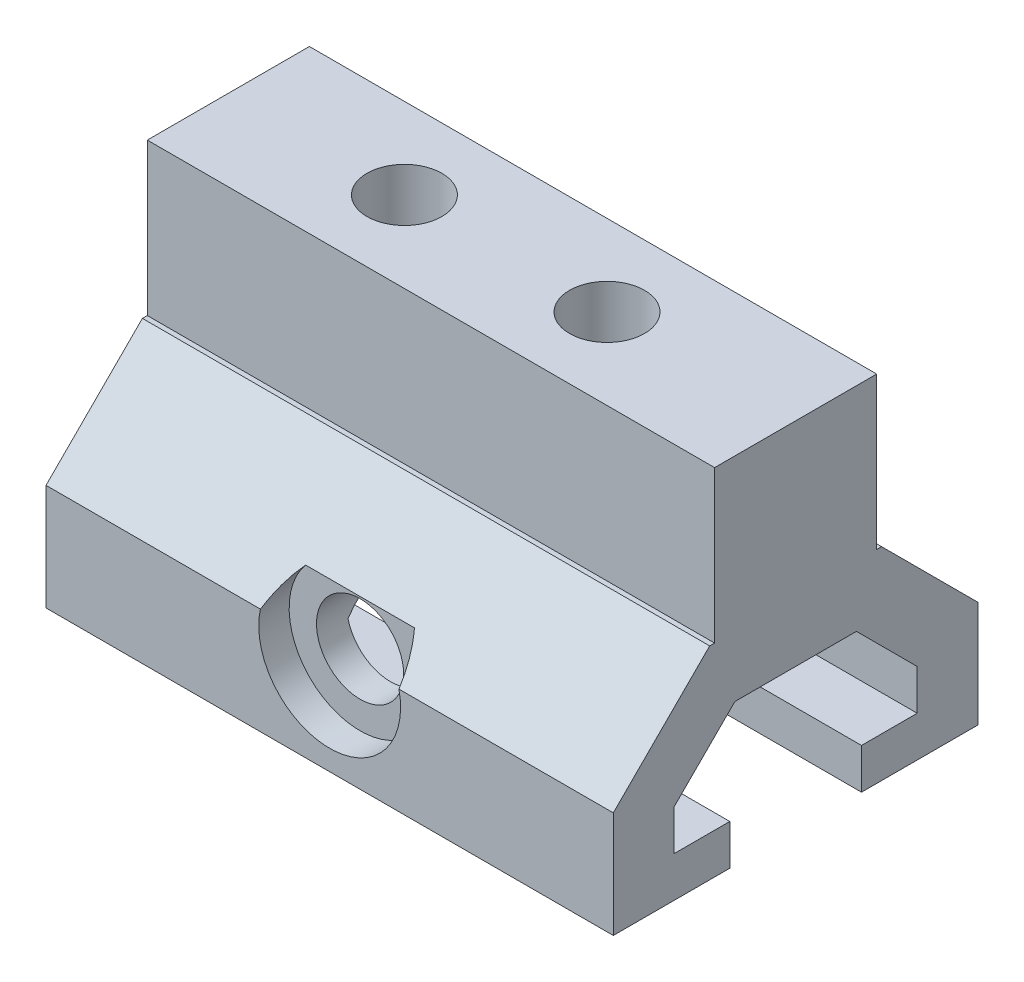
ISO-10303-21;
HEADER;
FILE_DESCRIPTION(('STEP AP214'),'2;1');
FILE_NAME('part.step','',(''),(''),'','','');
FILE_SCHEMA(('AUTOMOTIVE_DESIGN { 1 0 10303 214 1 1 1 1 }'));
ENDSEC;
DATA;
#1=APPLICATION_CONTEXT('core data for automotive mechanical design processes');
#2=APPLICATION_PROTOCOL_DEFINITION('international standard','automotive_design',2000,#1);
#3=PRODUCT_CONTEXT('',#1,'mechanical');
#4=PRODUCT('Part','Part','',(#3));
#5=PRODUCT_RELATED_PRODUCT_CATEGORY('part','',(#4));
#6=PRODUCT_DEFINITION_FORMATION('','',#4);
#7=PRODUCT_DEFINITION_CONTEXT('part definition',#1,'design');
#8=PRODUCT_DEFINITION('design','',#6,#7);
#9=PRODUCT_DEFINITION_SHAPE('','',#8);
#10=(LENGTH_UNIT() NAMED_UNIT(*) SI_UNIT(.MILLI.,.METRE.));
#11=(NAMED_UNIT(*) PLANE_ANGLE_UNIT() SI_UNIT($,.RADIAN.));
#12=(NAMED_UNIT(*) SI_UNIT($,.STERADIAN.) SOLID_ANGLE_UNIT());
#13=UNCERTAINTY_MEASURE_WITH_UNIT(LENGTH_MEASURE(1.E-05),#10,'distance_accuracy_value','');
#14=(GEOMETRIC_REPRESENTATION_CONTEXT(3) GLOBAL_UNCERTAINTY_ASSIGNED_CONTEXT((#13)) GLOBAL_UNIT_ASSIGNED_CONTEXT((#10,
#11,#12)) REPRESENTATION_CONTEXT('',''));
#15=CARTESIAN_POINT('',(0.,0.,0.));
#16=DIRECTION('',(0.,0.,1.));
#17=DIRECTION('',(1.,0.,0.));
#18=AXIS2_PLACEMENT_3D('',#15,#16,#17);
#19=CARTESIAN_POINT('',(-5.31,7.5,0.));
#20=DIRECTION('',(0.,-1.,0.));
#21=DIRECTION('',(0.,0.,-1.));
#22=AXIS2_PLACEMENT_3D('',#19,#20,#21);
#23=CYLINDRICAL_SURFACE('',#22,1.85);
#24=CARTESIAN_POINT('',(-5.31,7.5,0.));
#25=DIRECTION('',(0.,1.,0.));
#26=DIRECTION('',(0.,0.,1.));
#27=AXIS2_PLACEMENT_3D('',#24,#25,#26);
#28=CIRCLE('',#27,1.85);
#29=CARTESIAN_POINT('',(-5.31,7.5,1.85));
#30=VERTEX_POINT('',#29);
#31=EDGE_CURVE('E285',#30,#30,#28,.T.);
#32=ORIENTED_EDGE('',*,*,#31,.T.);
#33=EDGE_LOOP('',(#32));
#34=FACE_BOUND('',#33,.T.);
#35=CARTESIAN_POINT('',(-5.31,0.5,0.));
#36=DIRECTION('',(0.,-1.,0.));
#37=DIRECTION('',(0.,0.,-1.));
#38=AXIS2_PLACEMENT_3D('',#35,#36,#37);
#39=CIRCLE('',#38,1.85);
#40=CARTESIAN_POINT('',(-5.31,0.499999999999999,-1.85));
#41=VERTEX_POINT('',#40);
#42=EDGE_CURVE('E39',#41,#41,#39,.T.);
#43=ORIENTED_EDGE('',*,*,#42,.T.);
#44=EDGE_LOOP('',(#43));
#45=FACE_BOUND('',#44,.T.);
#46=ADVANCED_FACE('F35',(#34,#45),#23,.F.);
#47=CARTESIAN_POINT('',(4.69,7.5,0.));
#48=DIRECTION('',(0.,-1.,0.));
#49=DIRECTION('',(0.,0.,-1.));
#50=AXIS2_PLACEMENT_3D('',#47,#48,#49);
#51=CYLINDRICAL_SURFACE('',#50,1.85);
#52=CARTESIAN_POINT('',(4.69,7.5,0.));
#53=DIRECTION('',(0.,1.,0.));
#54=DIRECTION('',(0.,0.,1.));
#55=AXIS2_PLACEMENT_3D('',#52,#53,#54);
#56=CIRCLE('',#55,1.85);
#57=CARTESIAN_POINT('',(4.69,7.5,1.85));
#58=VERTEX_POINT('',#57);
#59=EDGE_CURVE('E237',#58,#58,#56,.T.);
#60=ORIENTED_EDGE('',*,*,#59,.T.);
#61=EDGE_LOOP('',(#60));
#62=FACE_BOUND('',#61,.T.);
#63=CARTESIAN_POINT('',(4.69,0.5,0.));
#64=DIRECTION('',(0.,-1.,0.));
#65=DIRECTION('',(0.,0.,-1.));
#66=AXIS2_PLACEMENT_3D('',#63,#64,#65);
#67=CIRCLE('',#66,1.85);
#68=CARTESIAN_POINT('',(4.69,0.499999999999999,-1.85));
#69=VERTEX_POINT('',#68);
#70=EDGE_CURVE('E310',#69,#69,#67,.T.);
#71=ORIENTED_EDGE('',*,*,#70,.T.);
#72=EDGE_LOOP('',(#71));
#73=FACE_BOUND('',#72,.T.);
#74=ADVANCED_FACE('F561',(#62,#73),#51,.F.);
#75=CARTESIAN_POINT('',(14.,-3.,2.99999999999996));
#76=DIRECTION('',(0.,-1.,0.));
#77=DIRECTION('',(0.,0.,-1.));
#78=AXIS2_PLACEMENT_3D('',#75,#76,#77);
#79=PLANE('',#78);
#80=CARTESIAN_POINT('',(-5.31,-3.,0.));
#81=DIRECTION('',(0.,-1.,0.));
#82=DIRECTION('',(0.,0.,-1.));
#83=AXIS2_PLACEMENT_3D('',#80,#81,#82);
#84=CIRCLE('',#83,3.);
#85=CARTESIAN_POINT('',(-5.31,-3.,-2.99999999999996));
#86=VERTEX_POINT('',#85);
#87=CARTESIAN_POINT('',(-5.31,-3.,2.99999999999997));
#88=VERTEX_POINT('',#87);
#89=EDGE_CURVE('E318',#86,#88,#84,.T.);
#90=ORIENTED_EDGE('',*,*,#89,.F.);
#91=DIRECTION('',(-1.,0.,0.));
#92=VECTOR('',#91,1.);
#93=CARTESIAN_POINT('',(14.,-3.,-2.99999999999997));
#94=LINE('',#93,#92);
#95=CARTESIAN_POINT('',(4.69,-3.,-2.99999999999997));
#96=VERTEX_POINT('',#95);
#97=EDGE_CURVE('E249',#96,#86,#94,.T.);
#98=ORIENTED_EDGE('',*,*,#97,.F.);
#99=CARTESIAN_POINT('',(4.69,-3.,0.));
#100=DIRECTION('',(0.,-1.,0.));
#101=DIRECTION('',(0.,0.,-1.));
#102=AXIS2_PLACEMENT_3D('',#99,#100,#101);
#103=CIRCLE('',#102,3.);
#104=CARTESIAN_POINT('',(4.69,-3.,2.99999999999997));
#105=VERTEX_POINT('',#104);
#106=EDGE_CURVE('E333',#105,#96,#103,.T.);
#107=ORIENTED_EDGE('',*,*,#106,.F.);
#108=DIRECTION('',(-1.,0.,0.));
#109=VECTOR('',#108,1.);
#110=CARTESIAN_POINT('',(14.,-3.,2.99999999999996));
#111=LINE('',#110,#109);
#112=EDGE_CURVE('E244',#105,#88,#111,.T.);
#113=ORIENTED_EDGE('',*,*,#112,.T.);
#114=EDGE_LOOP('',(#90,#98,#107,#113));
#115=FACE_BOUND('',#114,.T.);
#116=ADVANCED_FACE('F515',(#115),#79,.T.);
#117=EDGE_CURVE('E331',#96,#105,#103,.T.);
#118=ORIENTED_EDGE('',*,*,#117,.F.);
#119=CARTESIAN_POINT('',(14.,-3.,-2.99999999999997));
#120=VERTEX_POINT('',#119);
#121=EDGE_CURVE('E246',#120,#96,#94,.T.);
#122=ORIENTED_EDGE('',*,*,#121,.F.);
#123=DIRECTION('',(0.,0.,1.));
#124=VECTOR('',#123,1.);
#125=CARTESIAN_POINT('',(14.,-3.,2.99999999999996));
#126=LINE('',#125,#124);
#127=CARTESIAN_POINT('',(14.,-3.,2.99999999999996));
#128=VERTEX_POINT('',#127);
#129=EDGE_CURVE('E374',#120,#128,#126,.T.);
#130=ORIENTED_EDGE('',*,*,#129,.T.);
#131=EDGE_CURVE('E239',#128,#105,#111,.T.);
#132=ORIENTED_EDGE('',*,*,#131,.T.);
#133=EDGE_LOOP('',(#118,#122,#130,#132));
#134=FACE_BOUND('',#133,.T.);
#135=ADVANCED_FACE('F519',(#134),#79,.T.);
#136=CARTESIAN_POINT('',(0.,7.5,0.));
#137=DIRECTION('',(0.,1.,0.));
#138=DIRECTION('',(0.,0.,1.));
#139=AXIS2_PLACEMENT_3D('',#136,#137,#138);
#140=PLANE('',#139);
#141=ORIENTED_EDGE('',*,*,#31,.F.);
#142=EDGE_LOOP('',(#141));
#143=FACE_BOUND('',#142,.T.);
#144=DIRECTION('',(0.,0.,-1.));
#145=VECTOR('',#144,1.);
#146=CARTESIAN_POINT('',(14.,7.5,-4.));
#147=LINE('',#146,#145);
#148=CARTESIAN_POINT('',(14.,7.5,4.));
#149=VERTEX_POINT('',#148);
#150=CARTESIAN_POINT('',(14.,7.5,-4.));
#151=VERTEX_POINT('',#150);
#152=EDGE_CURVE('E289',#149,#151,#147,.T.);
#153=ORIENTED_EDGE('',*,*,#152,.T.);
#154=DIRECTION('',(-1.,0.,0.));
#155=VECTOR('',#154,1.);
#156=CARTESIAN_POINT('',(-14.,7.5,-4.));
#157=LINE('',#156,#155);
#158=CARTESIAN_POINT('',(-14.,7.5,-4.));
#159=VERTEX_POINT('',#158);
#160=EDGE_CURVE('E292',#151,#159,#157,.T.);
#161=ORIENTED_EDGE('',*,*,#160,.T.);
#162=DIRECTION('',(0.,0.,1.));
#163=VECTOR('',#162,1.);
#164=CARTESIAN_POINT('',(-14.,7.5,-4.));
#165=LINE('',#164,#163);
#166=CARTESIAN_POINT('',(-14.,7.5,4.));
#167=VERTEX_POINT('',#166);
#168=EDGE_CURVE('E295',#159,#167,#165,.T.);
#169=ORIENTED_EDGE('',*,*,#168,.T.);
#170=DIRECTION('',(1.,0.,0.));
#171=VECTOR('',#170,1.);
#172=CARTESIAN_POINT('',(-14.,7.5,4.));
#173=LINE('',#172,#171);
#174=EDGE_CURVE('E297',#167,#149,#173,.T.);
#175=ORIENTED_EDGE('',*,*,#174,.T.);
#176=EDGE_LOOP('',(#153,#161,#169,#175));
#177=FACE_BOUND('',#176,.T.);
#178=ORIENTED_EDGE('',*,*,#59,.F.);
#179=EDGE_LOOP('',(#178));
#180=FACE_BOUND('',#179,.T.);
#181=ADVANCED_FACE('F458',(#143,#177,#180),#140,.T.);
#182=CARTESIAN_POINT('',(14.,7.5,-4.));
#183=DIRECTION('',(-1.,0.,0.));
#184=DIRECTION('',(0.,0.,1.));
#185=AXIS2_PLACEMENT_3D('',#182,#183,#184);
#186=PLANE('',#185);
#187=DIRECTION('',(0.,-1.,0.));
#188=VECTOR('',#187,1.);
#189=CARTESIAN_POINT('',(14.,7.5,4.));
#190=LINE('',#189,#188);
#191=CARTESIAN_POINT('',(14.,0.,4.));
#192=VERTEX_POINT('',#191);
#193=EDGE_CURVE('E299',#149,#192,#190,.T.);
#194=ORIENTED_EDGE('',*,*,#193,.T.);
#195=DIRECTION('',(0.,0.,-1.));
#196=VECTOR('',#195,1.);
#197=CARTESIAN_POINT('',(14.,0.,-4.24264068711924));
#198=LINE('',#197,#196);
#199=CARTESIAN_POINT('',(14.,0.,4.24264068711924));
#200=VERTEX_POINT('',#199);
#201=EDGE_CURVE('E351',#200,#192,#198,.T.);
#202=ORIENTED_EDGE('',*,*,#201,.F.);
#203=DIRECTION('',(0.,0.707106781186543,-0.707106781186552));
#204=VECTOR('',#203,1.);
#205=CARTESIAN_POINT('',(14.,0.,4.24264068711924));
#206=LINE('',#205,#204);
#207=CARTESIAN_POINT('',(14.,-4.75735931288071,9.));
#208=VERTEX_POINT('',#207);
#209=EDGE_CURVE('E347',#208,#200,#206,.T.);
#210=ORIENTED_EDGE('',*,*,#209,.F.);
#211=DIRECTION('',(0.,1.,0.));
#212=VECTOR('',#211,1.);
#213=CARTESIAN_POINT('',(14.,-4.75735931288071,9.));
#214=LINE('',#213,#212);
#215=CARTESIAN_POINT('',(14.,-10.,9.));
#216=VERTEX_POINT('',#215);
#217=EDGE_CURVE('E344',#216,#208,#214,.T.);
#218=ORIENTED_EDGE('',*,*,#217,.F.);
#219=DIRECTION('',(0.,0.,1.));
#220=VECTOR('',#219,1.);
#221=CARTESIAN_POINT('',(14.,-10.,9.));
#222=LINE('',#221,#220);
#223=CARTESIAN_POINT('',(14.,-10.,3.25));
#224=VERTEX_POINT('',#223);
#225=EDGE_CURVE('E341',#224,#216,#222,.T.);
#226=ORIENTED_EDGE('',*,*,#225,.F.);
#227=DIRECTION('',(0.,-1.,0.));
#228=VECTOR('',#227,1.);
#229=CARTESIAN_POINT('',(14.,-10.,3.25));
#230=LINE('',#229,#228);
#231=CARTESIAN_POINT('',(14.,-8.,3.25));
#232=VERTEX_POINT('',#231);
#233=EDGE_CURVE('E337',#232,#224,#230,.T.);
#234=ORIENTED_EDGE('',*,*,#233,.F.);
#235=DIRECTION('',(0.,0.,-1.));
#236=VECTOR('',#235,1.);
#237=CARTESIAN_POINT('',(14.,-8.,3.25));
#238=LINE('',#237,#236);
#239=CARTESIAN_POINT('',(14.,-8.,6.));
#240=VERTEX_POINT('',#239);
#241=EDGE_CURVE('E334',#240,#232,#238,.T.);
#242=ORIENTED_EDGE('',*,*,#241,.F.);
#243=DIRECTION('',(0.,-1.,0.));
#244=VECTOR('',#243,1.);
#245=CARTESIAN_POINT('',(14.,-8.,6.));
#246=LINE('',#245,#244);
#247=CARTESIAN_POINT('',(14.,-6.,6.));
#248=VERTEX_POINT('',#247);
#249=EDGE_CURVE('E282',#248,#240,#246,.T.);
#250=ORIENTED_EDGE('',*,*,#249,.F.);
#251=DIRECTION('',(0.,-0.707106781186543,0.707106781186552));
#252=VECTOR('',#251,1.);
#253=CARTESIAN_POINT('',(14.,-6.,6.));
#254=LINE('',#253,#252);
#255=EDGE_CURVE('E233',#128,#248,#254,.T.);
#256=ORIENTED_EDGE('',*,*,#255,.F.);
#257=ORIENTED_EDGE('',*,*,#129,.F.);
#258=DIRECTION('',(0.,0.707106781186543,0.707106781186551));
#259=VECTOR('',#258,1.);
#260=CARTESIAN_POINT('',(14.,-6.,-6.));
#261=LINE('',#260,#259);
#262=CARTESIAN_POINT('',(14.,-6.,-6.));
#263=VERTEX_POINT('',#262);
#264=EDGE_CURVE('E371',#263,#120,#261,.T.);
#265=ORIENTED_EDGE('',*,*,#264,.F.);
#266=DIRECTION('',(0.,1.,0.));
#267=VECTOR('',#266,1.);
#268=CARTESIAN_POINT('',(14.,-8.,-6.));
#269=LINE('',#268,#267);
#270=CARTESIAN_POINT('',(14.,-8.,-6.));
#271=VERTEX_POINT('',#270);
#272=EDGE_CURVE('E368',#271,#263,#269,.T.);
#273=ORIENTED_EDGE('',*,*,#272,.F.);
#274=DIRECTION('',(0.,0.,-1.));
#275=VECTOR('',#274,1.);
#276=CARTESIAN_POINT('',(14.,-8.,-3.25));
#277=LINE('',#276,#275);
#278=CARTESIAN_POINT('',(14.,-8.,-3.25));
#279=VERTEX_POINT('',#278);
#280=EDGE_CURVE('E365',#279,#271,#277,.T.);
#281=ORIENTED_EDGE('',*,*,#280,.F.);
#282=DIRECTION('',(0.,1.,0.));
#283=VECTOR('',#282,1.);
#284=CARTESIAN_POINT('',(14.,-10.,-3.25));
#285=LINE('',#284,#283);
#286=CARTESIAN_POINT('',(14.,-10.,-3.25));
#287=VERTEX_POINT('',#286);
#288=EDGE_CURVE('E362',#287,#279,#285,.T.);
#289=ORIENTED_EDGE('',*,*,#288,.F.);
#290=DIRECTION('',(0.,0.,1.));
#291=VECTOR('',#290,1.);
#292=CARTESIAN_POINT('',(14.,-10.,-9.));
#293=LINE('',#292,#291);
#294=CARTESIAN_POINT('',(14.,-10.,-9.));
#295=VERTEX_POINT('',#294);
#296=EDGE_CURVE('E359',#295,#287,#293,.T.);
#297=ORIENTED_EDGE('',*,*,#296,.F.);
#298=DIRECTION('',(0.,-1.,0.));
#299=VECTOR('',#298,1.);
#300=CARTESIAN_POINT('',(14.,-4.75735931288071,-9.00000000000001));
#301=LINE('',#300,#299);
#302=CARTESIAN_POINT('',(14.,-4.75735931288071,-9.00000000000001));
#303=VERTEX_POINT('',#302);
#304=EDGE_CURVE('E356',#303,#295,#301,.T.);
#305=ORIENTED_EDGE('',*,*,#304,.F.);
#306=DIRECTION('',(0.,-0.707106781186544,-0.707106781186551));
#307=VECTOR('',#306,1.);
#308=CARTESIAN_POINT('',(14.,0.,-4.24264068711924));
#309=LINE('',#308,#307);
#310=CARTESIAN_POINT('',(14.,0.,-4.24264068711924));
#311=VERTEX_POINT('',#310);
#312=EDGE_CURVE('E353',#311,#303,#309,.T.);
#313=ORIENTED_EDGE('',*,*,#312,.F.);
#314=CARTESIAN_POINT('',(14.,0.,-4.));
#315=VERTEX_POINT('',#314);
#316=EDGE_CURVE('E350',#315,#311,#198,.T.);
#317=ORIENTED_EDGE('',*,*,#316,.F.);
#318=DIRECTION('',(0.,-1.,0.));
#319=VECTOR('',#318,1.);
#320=CARTESIAN_POINT('',(14.,7.5,-4.));
#321=LINE('',#320,#319);
#322=EDGE_CURVE('E11',#151,#315,#321,.T.);
#323=ORIENTED_EDGE('',*,*,#322,.F.);
#324=ORIENTED_EDGE('',*,*,#152,.F.);
#325=EDGE_LOOP('',(#194,#202,#210,#218,#226,#234,#242,#250,#256,#257,#265,#273,#281,#289,#297,
#305,#313,#317,#323,#324));
#326=FACE_BOUND('',#325,.T.);
#327=ADVANCED_FACE('F37',(#326),#186,.F.);
#328=CARTESIAN_POINT('',(-14.,7.5,-4.));
#329=DIRECTION('',(0.,0.,1.));
#330=DIRECTION('',(1.,0.,0.));
#331=AXIS2_PLACEMENT_3D('',#328,#329,#330);
#332=PLANE('',#331);
#333=DIRECTION('',(-1.,0.,0.));
#334=VECTOR('',#333,1.);
#335=CARTESIAN_POINT('',(-14.,0.,-4.));
#336=LINE('',#335,#334);
#337=CARTESIAN_POINT('',(-14.,0.,-4.));
#338=VERTEX_POINT('',#337);
#339=EDGE_CURVE('E288',#315,#338,#336,.T.);
#340=ORIENTED_EDGE('',*,*,#339,.T.);
#341=DIRECTION('',(0.,-1.,0.));
#342=VECTOR('',#341,1.);
#343=CARTESIAN_POINT('',(-14.,7.5,-4.));
#344=LINE('',#343,#342);
#345=EDGE_CURVE('E44',#159,#338,#344,.T.);
#346=ORIENTED_EDGE('',*,*,#345,.F.);
#347=ORIENTED_EDGE('',*,*,#160,.F.);
#348=ORIENTED_EDGE('',*,*,#322,.T.);
#349=EDGE_LOOP('',(#340,#346,#347,#348));
#350=FACE_BOUND('',#349,.T.);
#351=ADVANCED_FACE('F463',(#350),#332,.F.);
#352=CARTESIAN_POINT('',(-14.,7.5,-4.));
#353=DIRECTION('',(1.,0.,0.));
#354=DIRECTION('',(0.,0.,-1.));
#355=AXIS2_PLACEMENT_3D('',#352,#353,#354);
#356=PLANE('',#355);
#357=ORIENTED_EDGE('',*,*,#345,.T.);
#358=DIRECTION('',(0.,0.,-1.));
#359=VECTOR('',#358,1.);
#360=CARTESIAN_POINT('',(-14.,0.,-4.24264068711924));
#361=LINE('',#360,#359);
#362=CARTESIAN_POINT('',(-14.,0.,-4.24264068711924));
#363=VERTEX_POINT('',#362);
#364=EDGE_CURVE('E393',#338,#363,#361,.T.);
#365=ORIENTED_EDGE('',*,*,#364,.T.);
#366=DIRECTION('',(0.,-0.707106781186544,-0.707106781186551));
#367=VECTOR('',#366,1.);
#368=CARTESIAN_POINT('',(-14.,0.,-4.24264068711924));
#369=LINE('',#368,#367);
#370=CARTESIAN_POINT('',(-14.,-4.75735931288071,-9.));
#371=VERTEX_POINT('',#370);
#372=EDGE_CURVE('E397',#363,#371,#369,.T.);
#373=ORIENTED_EDGE('',*,*,#372,.T.);
#374=DIRECTION('',(0.,-1.,0.));
#375=VECTOR('',#374,1.);
#376=CARTESIAN_POINT('',(-14.,-4.75735931288071,-9.));
#377=LINE('',#376,#375);
#378=CARTESIAN_POINT('',(-14.,-10.,-8.99999999999999));
#379=VERTEX_POINT('',#378);
#380=EDGE_CURVE('E400',#371,#379,#377,.T.);
#381=ORIENTED_EDGE('',*,*,#380,.T.);
#382=DIRECTION('',(0.,0.,1.));
#383=VECTOR('',#382,1.);
#384=CARTESIAN_POINT('',(-14.,-10.,-8.99999999999999));
#385=LINE('',#384,#383);
#386=CARTESIAN_POINT('',(-14.,-10.,-3.24999999999999));
#387=VERTEX_POINT('',#386);
#388=EDGE_CURVE('E403',#379,#387,#385,.T.);
#389=ORIENTED_EDGE('',*,*,#388,.T.);
#390=DIRECTION('',(0.,1.,0.));
#391=VECTOR('',#390,1.);
#392=CARTESIAN_POINT('',(-14.,-10.,-3.24999999999999));
#393=LINE('',#392,#391);
#394=CARTESIAN_POINT('',(-14.,-8.,-3.25));
#395=VERTEX_POINT('',#394);
#396=EDGE_CURVE('E406',#387,#395,#393,.T.);
#397=ORIENTED_EDGE('',*,*,#396,.T.);
#398=DIRECTION('',(0.,0.,-1.));
#399=VECTOR('',#398,1.);
#400=CARTESIAN_POINT('',(-14.,-8.,-3.25));
#401=LINE('',#400,#399);
#402=CARTESIAN_POINT('',(-14.,-8.,-6.));
#403=VERTEX_POINT('',#402);
#404=EDGE_CURVE('E409',#395,#403,#401,.T.);
#405=ORIENTED_EDGE('',*,*,#404,.T.);
#406=DIRECTION('',(0.,1.,0.));
#407=VECTOR('',#406,1.);
#408=CARTESIAN_POINT('',(-14.,-8.,-6.));
#409=LINE('',#408,#407);
#410=CARTESIAN_POINT('',(-14.,-6.,-6.));
#411=VERTEX_POINT('',#410);
#412=EDGE_CURVE('E412',#403,#411,#409,.T.);
#413=ORIENTED_EDGE('',*,*,#412,.T.);
#414=DIRECTION('',(0.,0.707106781186543,0.707106781186551));
#415=VECTOR('',#414,1.);
#416=CARTESIAN_POINT('',(-14.,-6.,-6.));
#417=LINE('',#416,#415);
#418=CARTESIAN_POINT('',(-14.,-3.,-2.99999999999996));
#419=VERTEX_POINT('',#418);
#420=EDGE_CURVE('E415',#411,#419,#417,.T.);
#421=ORIENTED_EDGE('',*,*,#420,.T.);
#422=DIRECTION('',(0.,0.,1.));
#423=VECTOR('',#422,1.);
#424=CARTESIAN_POINT('',(-14.,-3.,2.99999999999997));
#425=LINE('',#424,#423);
#426=CARTESIAN_POINT('',(-14.,-3.,2.99999999999997));
#427=VERTEX_POINT('',#426);
#428=EDGE_CURVE('E418',#419,#427,#425,.T.);
#429=ORIENTED_EDGE('',*,*,#428,.T.);
#430=DIRECTION('',(0.,-0.707106781186543,0.707106781186552));
#431=VECTOR('',#430,1.);
#432=CARTESIAN_POINT('',(-14.,-6.,6.00000000000001));
#433=LINE('',#432,#431);
#434=CARTESIAN_POINT('',(-14.,-6.,6.00000000000001));
#435=VERTEX_POINT('',#434);
#436=EDGE_CURVE('E421',#427,#435,#433,.T.);
#437=ORIENTED_EDGE('',*,*,#436,.T.);
#438=DIRECTION('',(0.,-1.,0.));
#439=VECTOR('',#438,1.);
#440=CARTESIAN_POINT('',(-14.,-8.,6.00000000000001));
#441=LINE('',#440,#439);
#442=CARTESIAN_POINT('',(-14.,-8.,6.00000000000001));
#443=VERTEX_POINT('',#442);
#444=EDGE_CURVE('E338',#435,#443,#441,.T.);
#445=ORIENTED_EDGE('',*,*,#444,.T.);
#446=DIRECTION('',(0.,0.,-1.));
#447=VECTOR('',#446,1.);
#448=CARTESIAN_POINT('',(-14.,-8.,3.25));
#449=LINE('',#448,#447);
#450=CARTESIAN_POINT('',(-14.,-8.,3.25));
#451=VERTEX_POINT('',#450);
#452=EDGE_CURVE('E316',#443,#451,#449,.T.);
#453=ORIENTED_EDGE('',*,*,#452,.T.);
#454=DIRECTION('',(0.,-1.,0.));
#455=VECTOR('',#454,1.);
#456=CARTESIAN_POINT('',(-14.,-10.,3.25));
#457=LINE('',#456,#455);
#458=CARTESIAN_POINT('',(-14.,-10.,3.25));
#459=VERTEX_POINT('',#458);
#460=EDGE_CURVE('E381',#451,#459,#457,.T.);
#461=ORIENTED_EDGE('',*,*,#460,.T.);
#462=DIRECTION('',(0.,0.,1.));
#463=VECTOR('',#462,1.);
#464=CARTESIAN_POINT('',(-14.,-10.,9.00000000000001));
#465=LINE('',#464,#463);
#466=CARTESIAN_POINT('',(-14.,-10.,9.00000000000001));
#467=VERTEX_POINT('',#466);
#468=EDGE_CURVE('E384',#459,#467,#465,.T.);
#469=ORIENTED_EDGE('',*,*,#468,.T.);
#470=DIRECTION('',(0.,1.,0.));
#471=VECTOR('',#470,1.);
#472=CARTESIAN_POINT('',(-14.,-4.75735931288071,9.00000000000001));
#473=LINE('',#472,#471);
#474=CARTESIAN_POINT('',(-14.,-4.75735931288071,9.00000000000001));
#475=VERTEX_POINT('',#474);
#476=EDGE_CURVE('E387',#467,#475,#473,.T.);
#477=ORIENTED_EDGE('',*,*,#476,.T.);
#478=DIRECTION('',(0.,0.707106781186543,-0.707106781186552));
#479=VECTOR('',#478,1.);
#480=CARTESIAN_POINT('',(-14.,0.,4.24264068711924));
#481=LINE('',#480,#479);
#482=CARTESIAN_POINT('',(-14.,0.,4.24264068711924));
#483=VERTEX_POINT('',#482);
#484=EDGE_CURVE('E390',#475,#483,#481,.T.);
#485=ORIENTED_EDGE('',*,*,#484,.T.);
#486=CARTESIAN_POINT('',(-14.,0.,4.));
#487=VERTEX_POINT('',#486);
#488=EDGE_CURVE('E394',#483,#487,#361,.T.);
#489=ORIENTED_EDGE('',*,*,#488,.T.);
#490=DIRECTION('',(0.,-1.,0.));
#491=VECTOR('',#490,1.);
#492=CARTESIAN_POINT('',(-14.,7.5,4.));
#493=LINE('',#492,#491);
#494=EDGE_CURVE('E306',#167,#487,#493,.T.);
#495=ORIENTED_EDGE('',*,*,#494,.F.);
#496=ORIENTED_EDGE('',*,*,#168,.F.);
#497=EDGE_LOOP('',(#357,#365,#373,#381,#389,#397,#405,#413,#421,#429,#437,#445,#453,#461,#469,
#477,#485,#489,#495,#496));
#498=FACE_BOUND('',#497,.T.);
#499=ADVANCED_FACE('F425',(#498),#356,.F.);
#500=CARTESIAN_POINT('',(-14.,7.5,4.));
#501=DIRECTION('',(0.,0.,-1.));
#502=DIRECTION('',(-1.,0.,0.));
#503=AXIS2_PLACEMENT_3D('',#500,#501,#502);
#504=PLANE('',#503);
#505=DIRECTION('',(1.,0.,0.));
#506=VECTOR('',#505,1.);
#507=CARTESIAN_POINT('',(-14.,0.,4.));
#508=LINE('',#507,#506);
#509=EDGE_CURVE('E293',#487,#192,#508,.T.);
#510=ORIENTED_EDGE('',*,*,#509,.T.);
#511=ORIENTED_EDGE('',*,*,#193,.F.);
#512=ORIENTED_EDGE('',*,*,#174,.F.);
#513=ORIENTED_EDGE('',*,*,#494,.T.);
#514=EDGE_LOOP('',(#510,#511,#512,#513));
#515=FACE_BOUND('',#514,.T.);
#516=ADVANCED_FACE('F454',(#515),#504,.F.);
#517=CARTESIAN_POINT('',(14.,0.,-4.24264068711924));
#518=DIRECTION('',(0.,1.,0.));
#519=DIRECTION('',(0.,0.,1.));
#520=AXIS2_PLACEMENT_3D('',#517,#518,#519);
#521=PLANE('',#520);
#522=ORIENTED_EDGE('',*,*,#509,.F.);
#523=ORIENTED_EDGE('',*,*,#488,.F.);
#524=DIRECTION('',(-1.,0.,0.));
#525=VECTOR('',#524,1.);
#526=CARTESIAN_POINT('',(14.,0.,4.24264068711924));
#527=LINE('',#526,#525);
#528=EDGE_CURVE('E270',#200,#483,#527,.T.);
#529=ORIENTED_EDGE('',*,*,#528,.F.);
#530=ORIENTED_EDGE('',*,*,#201,.T.);
#531=EDGE_LOOP('',(#522,#523,#529,#530));
#532=FACE_BOUND('',#531,.T.);
#533=ADVANCED_FACE('F548',(#532),#521,.T.);
#534=CARTESIAN_POINT('',(14.,-8.,3.25));
#535=DIRECTION('',(0.,1.,0.));
#536=DIRECTION('',(0.,0.,1.));
#537=AXIS2_PLACEMENT_3D('',#534,#535,#536);
#538=PLANE('',#537);
#539=ORIENTED_EDGE('',*,*,#452,.F.);
#540=DIRECTION('',(-1.,0.,0.));
#541=VECTOR('',#540,1.);
#542=CARTESIAN_POINT('',(14.,-8.,6.));
#543=LINE('',#542,#541);
#544=EDGE_CURVE('E235',#240,#443,#543,.T.);
#545=ORIENTED_EDGE('',*,*,#544,.F.);
#546=ORIENTED_EDGE('',*,*,#241,.T.);
#547=DIRECTION('',(-1.,0.,0.));
#548=VECTOR('',#547,1.);
#549=CARTESIAN_POINT('',(14.,-8.,3.25));
#550=LINE('',#549,#548);
#551=EDGE_CURVE('E280',#232,#451,#550,.T.);
#552=ORIENTED_EDGE('',*,*,#551,.T.);
#553=EDGE_LOOP('',(#539,#545,#546,#552));
#554=FACE_BOUND('',#553,.T.);
#555=ADVANCED_FACE('F430',(#554),#538,.T.);
#556=CARTESIAN_POINT('',(14.,-8.,6.));
#557=DIRECTION('',(0.,0.,-1.));
#558=DIRECTION('',(0.,1.,0.));
#559=AXIS2_PLACEMENT_3D('',#556,#557,#558);
#560=PLANE('',#559);
#561=CARTESIAN_POINT('',(0.,-5.5,6.));
#562=DIRECTION('',(0.,0.,-1.));
#563=DIRECTION('',(0.,1.,0.));
#564=AXIS2_PLACEMENT_3D('',#561,#562,#563);
#565=CIRCLE('',#564,2.15);
#566=CARTESIAN_POINT('',(2.09105236663265,-6.,6.));
#567=VERTEX_POINT('',#566);
#568=CARTESIAN_POINT('',(-2.09105236663264,-6.,6.));
#569=VERTEX_POINT('',#568);
#570=EDGE_CURVE('E51',#567,#569,#565,.T.);
#571=ORIENTED_EDGE('',*,*,#570,.F.);
#572=DIRECTION('',(-1.,0.,0.));
#573=VECTOR('',#572,1.);
#574=CARTESIAN_POINT('',(14.,-6.,6.));
#575=LINE('',#574,#573);
#576=EDGE_CURVE('E225',#248,#567,#575,.T.);
#577=ORIENTED_EDGE('',*,*,#576,.F.);
#578=ORIENTED_EDGE('',*,*,#249,.T.);
#579=ORIENTED_EDGE('',*,*,#544,.T.);
#580=ORIENTED_EDGE('',*,*,#444,.F.);
#581=EDGE_CURVE('E228',#569,#435,#575,.T.);
#582=ORIENTED_EDGE('',*,*,#581,.F.);
#583=EDGE_LOOP('',(#571,#577,#578,#579,#580,#582));
#584=FACE_BOUND('',#583,.T.);
#585=ADVANCED_FACE('F223',(#584),#560,.T.);
#586=CARTESIAN_POINT('',(14.,-6.,6.));
#587=DIRECTION('',(0.,-0.707106781186552,-0.707106781186543));
#588=DIRECTION('',(0.,0.707106781186543,-0.707106781186552));
#589=AXIS2_PLACEMENT_3D('',#586,#587,#588);
#590=PLANE('',#589);
#591=CARTESIAN_POINT('',(0.,-5.5,5.49999999999999));
#592=DIRECTION('',(0.,-0.707106781186552,-0.707106781186543));
#593=DIRECTION('',(0.,-0.707106781186543,0.707106781186552));
#594=AXIS2_PLACEMENT_3D('',#591,#592,#593);
#595=ELLIPSE('',#594,3.04055915910217,2.15);
#596=EDGE_CURVE('E214',#569,#567,#595,.T.);
#597=ORIENTED_EDGE('',*,*,#596,.F.);
#598=ORIENTED_EDGE('',*,*,#581,.T.);
#599=ORIENTED_EDGE('',*,*,#436,.F.);
#600=EDGE_CURVE('E245',#88,#427,#111,.T.);
#601=ORIENTED_EDGE('',*,*,#600,.F.);
#602=ORIENTED_EDGE('',*,*,#112,.F.);
#603=ORIENTED_EDGE('',*,*,#131,.F.);
#604=ORIENTED_EDGE('',*,*,#255,.T.);
#605=ORIENTED_EDGE('',*,*,#576,.T.);
#606=EDGE_LOOP('',(#597,#598,#599,#601,#602,#603,#604,#605));
#607=FACE_BOUND('',#606,.T.);
#608=ADVANCED_FACE('F231',(#607),#590,.T.);
#609=EDGE_CURVE('E322',#88,#86,#84,.T.);
#610=ORIENTED_EDGE('',*,*,#609,.F.);
#611=ORIENTED_EDGE('',*,*,#600,.T.);
#612=ORIENTED_EDGE('',*,*,#428,.F.);
#613=EDGE_CURVE('E250',#86,#419,#94,.T.);
#614=ORIENTED_EDGE('',*,*,#613,.F.);
#615=EDGE_LOOP('',(#610,#611,#612,#614));
#616=FACE_BOUND('',#615,.T.);
#617=ADVANCED_FACE('F508',(#616),#79,.T.);
#618=CARTESIAN_POINT('',(14.,-6.,-6.));
#619=DIRECTION('',(0.,-0.707106781186551,0.707106781186544));
#620=DIRECTION('',(0.,-0.707106781186544,-0.707106781186551));
#621=AXIS2_PLACEMENT_3D('',#618,#619,#620);
#622=PLANE('',#621);
#623=CARTESIAN_POINT('',(0.,-5.5,-5.49999999999999));
#624=DIRECTION('',(0.,-0.707106781186551,0.707106781186544));
#625=DIRECTION('',(0.,0.707106781186544,0.707106781186551));
#626=AXIS2_PLACEMENT_3D('',#623,#624,#625);
#627=ELLIPSE('',#626,2.6870057685089,1.9);
#628=CARTESIAN_POINT('',(1.83303027798233,-6.,-6.));
#629=VERTEX_POINT('',#628);
#630=CARTESIAN_POINT('',(-1.83303027798234,-6.,-6.));
#631=VERTEX_POINT('',#630);
#632=EDGE_CURVE('E325',#629,#631,#627,.T.);
#633=ORIENTED_EDGE('',*,*,#632,.F.);
#634=DIRECTION('',(-1.,0.,0.));
#635=VECTOR('',#634,1.);
#636=CARTESIAN_POINT('',(14.,-6.,-6.));
#637=LINE('',#636,#635);
#638=EDGE_CURVE('E251',#263,#629,#637,.T.);
#639=ORIENTED_EDGE('',*,*,#638,.F.);
#640=ORIENTED_EDGE('',*,*,#264,.T.);
#641=ORIENTED_EDGE('',*,*,#121,.T.);
#642=ORIENTED_EDGE('',*,*,#97,.T.);
#643=ORIENTED_EDGE('',*,*,#613,.T.);
#644=ORIENTED_EDGE('',*,*,#420,.F.);
#645=EDGE_CURVE('E254',#631,#411,#637,.T.);
#646=ORIENTED_EDGE('',*,*,#645,.F.);
#647=EDGE_LOOP('',(#633,#639,#640,#641,#642,#643,#644,#646));
#648=FACE_BOUND('',#647,.T.);
#649=ADVANCED_FACE('F502',(#648),#622,.T.);
#650=CARTESIAN_POINT('',(14.,-8.,-6.));
#651=DIRECTION('',(0.,0.,1.));
#652=DIRECTION('',(0.,-1.,0.));
#653=AXIS2_PLACEMENT_3D('',#650,#651,#652);
#654=PLANE('',#653);
#655=CARTESIAN_POINT('',(0.,-5.5,-6.));
#656=DIRECTION('',(0.,0.,1.));
#657=DIRECTION('',(0.,-1.,0.));
#658=AXIS2_PLACEMENT_3D('',#655,#656,#657);
#659=CIRCLE('',#658,1.9);
#660=EDGE_CURVE('E499',#631,#629,#659,.T.);
#661=ORIENTED_EDGE('',*,*,#660,.F.);
#662=ORIENTED_EDGE('',*,*,#645,.T.);
#663=ORIENTED_EDGE('',*,*,#412,.F.);
#664=DIRECTION('',(-1.,0.,0.));
#665=VECTOR('',#664,1.);
#666=CARTESIAN_POINT('',(14.,-8.,-6.));
#667=LINE('',#666,#665);
#668=EDGE_CURVE('E255',#271,#403,#667,.T.);
#669=ORIENTED_EDGE('',*,*,#668,.F.);
#670=ORIENTED_EDGE('',*,*,#272,.T.);
#671=ORIENTED_EDGE('',*,*,#638,.T.);
#672=EDGE_LOOP('',(#661,#662,#663,#669,#670,#671));
#673=FACE_BOUND('',#672,.T.);
#674=ADVANCED_FACE('F496',(#673),#654,.T.);
#675=CARTESIAN_POINT('',(14.,-8.,-3.25));
#676=DIRECTION('',(0.,1.,0.));
#677=DIRECTION('',(0.,0.,1.));
#678=AXIS2_PLACEMENT_3D('',#675,#676,#677);
#679=PLANE('',#678);
#680=ORIENTED_EDGE('',*,*,#404,.F.);
#681=DIRECTION('',(-1.,0.,0.));
#682=VECTOR('',#681,1.);
#683=CARTESIAN_POINT('',(14.,-8.,-3.25));
#684=LINE('',#683,#682);
#685=EDGE_CURVE('E257',#279,#395,#684,.T.);
#686=ORIENTED_EDGE('',*,*,#685,.F.);
#687=ORIENTED_EDGE('',*,*,#280,.T.);
#688=ORIENTED_EDGE('',*,*,#668,.T.);
#689=EDGE_LOOP('',(#680,#686,#687,#688));
#690=FACE_BOUND('',#689,.T.);
#691=ADVANCED_FACE('F491',(#690),#679,.T.);
#692=CARTESIAN_POINT('',(14.,-10.,-3.25));
#693=DIRECTION('',(0.,0.,1.));
#694=DIRECTION('',(0.,-1.,0.));
#695=AXIS2_PLACEMENT_3D('',#692,#693,#694);
#696=PLANE('',#695);
#697=ORIENTED_EDGE('',*,*,#396,.F.);
#698=DIRECTION('',(-1.,0.,0.));
#699=VECTOR('',#698,1.);
#700=CARTESIAN_POINT('',(14.,-10.,-3.25));
#701=LINE('',#700,#699);
#702=EDGE_CURVE('E259',#287,#387,#701,.T.);
#703=ORIENTED_EDGE('',*,*,#702,.F.);
#704=ORIENTED_EDGE('',*,*,#288,.T.);
#705=ORIENTED_EDGE('',*,*,#685,.T.);
#706=EDGE_LOOP('',(#697,#703,#704,#705));
#707=FACE_BOUND('',#706,.T.);
#708=ADVANCED_FACE('F487',(#707),#696,.T.);
#709=CARTESIAN_POINT('',(14.,-10.,-9.));
#710=DIRECTION('',(0.,-1.,0.));
#711=DIRECTION('',(0.,0.,-1.));
#712=AXIS2_PLACEMENT_3D('',#709,#710,#711);
#713=PLANE('',#712);
#714=ORIENTED_EDGE('',*,*,#388,.F.);
#715=DIRECTION('',(-1.,0.,0.));
#716=VECTOR('',#715,1.);
#717=CARTESIAN_POINT('',(14.,-10.,-9.));
#718=LINE('',#717,#716);
#719=EDGE_CURVE('E261',#295,#379,#718,.T.);
#720=ORIENTED_EDGE('',*,*,#719,.F.);
#721=ORIENTED_EDGE('',*,*,#296,.T.);
#722=ORIENTED_EDGE('',*,*,#702,.T.);
#723=EDGE_LOOP('',(#714,#720,#721,#722));
#724=FACE_BOUND('',#723,.T.);
#725=ADVANCED_FACE('F483',(#724),#713,.T.);
#726=CARTESIAN_POINT('',(14.,-4.75735931288071,-9.00000000000001));
#727=DIRECTION('',(0.,0.,-1.));
#728=DIRECTION('',(0.,1.,0.));
#729=AXIS2_PLACEMENT_3D('',#726,#727,#728);
#730=PLANE('',#729);
#731=CARTESIAN_POINT('',(0.,-5.5,-9.00000000000001));
#732=DIRECTION('',(0.,0.,1.));
#733=DIRECTION('',(1.,0.,0.));
#734=AXIS2_PLACEMENT_3D('',#731,#732,#733);
#735=CIRCLE('',#734,1.9);
#736=CARTESIAN_POINT('',(-1.74885242654576,-4.75735931288071,-9.));
#737=VERTEX_POINT('',#736);
#738=CARTESIAN_POINT('',(1.74885242654576,-4.75735931288071,-9.00000000000001));
#739=VERTEX_POINT('',#738);
#740=EDGE_CURVE('E524',#737,#739,#735,.T.);
#741=ORIENTED_EDGE('',*,*,#740,.T.);
#742=DIRECTION('',(-1.,0.,0.));
#743=VECTOR('',#742,1.);
#744=CARTESIAN_POINT('',(14.,-4.75735931288071,-9.00000000000001));
#745=LINE('',#744,#743);
#746=EDGE_CURVE('E263',#303,#739,#745,.T.);
#747=ORIENTED_EDGE('',*,*,#746,.F.);
#748=ORIENTED_EDGE('',*,*,#304,.T.);
#749=ORIENTED_EDGE('',*,*,#719,.T.);
#750=ORIENTED_EDGE('',*,*,#380,.F.);
#751=EDGE_CURVE('E266',#737,#371,#745,.T.);
#752=ORIENTED_EDGE('',*,*,#751,.F.);
#753=EDGE_LOOP('',(#741,#747,#748,#749,#750,#752));
#754=FACE_BOUND('',#753,.T.);
#755=ADVANCED_FACE('F481',(#754),#730,.T.);
#756=CARTESIAN_POINT('',(14.,0.,-4.24264068711924));
#757=DIRECTION('',(0.,0.707106781186551,-0.707106781186544));
#758=DIRECTION('',(0.,0.707106781186544,0.707106781186551));
#759=AXIS2_PLACEMENT_3D('',#756,#757,#758);
#760=PLANE('',#759);
#761=CARTESIAN_POINT('',(0.,-5.5,-9.7426406871193));
#762=DIRECTION('',(0.,0.707106781186551,-0.707106781186544));
#763=DIRECTION('',(0.,0.707106781186544,0.707106781186551));
#764=AXIS2_PLACEMENT_3D('',#761,#762,#763);
#765=ELLIPSE('',#764,2.6870057685089,1.9);
#766=EDGE_CURVE('E523',#737,#739,#765,.T.);
#767=ORIENTED_EDGE('',*,*,#766,.F.);
#768=ORIENTED_EDGE('',*,*,#751,.T.);
#769=ORIENTED_EDGE('',*,*,#372,.F.);
#770=DIRECTION('',(-1.,0.,0.));
#771=VECTOR('',#770,1.);
#772=CARTESIAN_POINT('',(14.,0.,-4.24264068711924));
#773=LINE('',#772,#771);
#774=EDGE_CURVE('E267',#311,#363,#773,.T.);
#775=ORIENTED_EDGE('',*,*,#774,.F.);
#776=ORIENTED_EDGE('',*,*,#312,.T.);
#777=ORIENTED_EDGE('',*,*,#746,.T.);
#778=EDGE_LOOP('',(#767,#768,#769,#775,#776,#777));
#779=FACE_BOUND('',#778,.T.);
#780=ADVANCED_FACE('F474',(#779),#760,.T.);
#781=ORIENTED_EDGE('',*,*,#339,.F.);
#782=ORIENTED_EDGE('',*,*,#316,.T.);
#783=ORIENTED_EDGE('',*,*,#774,.T.);
#784=ORIENTED_EDGE('',*,*,#364,.F.);
#785=EDGE_LOOP('',(#781,#782,#783,#784));
#786=FACE_BOUND('',#785,.T.);
#787=ADVANCED_FACE('F466',(#786),#521,.T.);
#788=CARTESIAN_POINT('',(14.,0.,4.24264068711924));
#789=DIRECTION('',(0.,0.707106781186552,0.707106781186543));
#790=DIRECTION('',(0.,-0.707106781186543,0.707106781186552));
#791=AXIS2_PLACEMENT_3D('',#788,#789,#790);
#792=PLANE('',#791);
#793=CARTESIAN_POINT('',(0.,-5.5,9.7426406871193));
#794=DIRECTION('',(0.,0.707106781186552,0.707106781186543));
#795=DIRECTION('',(0.,-0.707106781186543,0.707106781186552));
#796=AXIS2_PLACEMENT_3D('',#793,#794,#795);
#797=ELLIPSE('',#796,4.94974746830586,3.5);
#798=CARTESIAN_POINT('',(3.42030478317869,-4.75735931288071,9.));
#799=VERTEX_POINT('',#798);
#800=CARTESIAN_POINT('',(2.68711048311699,-3.25735931288072,7.5));
#801=VERTEX_POINT('',#800);
#802=EDGE_CURVE('E528',#799,#801,#797,.T.);
#803=ORIENTED_EDGE('',*,*,#802,.F.);
#804=DIRECTION('',(-1.,0.,0.));
#805=VECTOR('',#804,1.);
#806=CARTESIAN_POINT('',(14.,-4.75735931288071,9.));
#807=LINE('',#806,#805);
#808=EDGE_CURVE('E272',#208,#799,#807,.T.);
#809=ORIENTED_EDGE('',*,*,#808,.F.);
#810=ORIENTED_EDGE('',*,*,#209,.T.);
#811=ORIENTED_EDGE('',*,*,#528,.T.);
#812=ORIENTED_EDGE('',*,*,#484,.F.);
#813=CARTESIAN_POINT('',(-3.42030478317868,-4.75735931288071,9.));
#814=VERTEX_POINT('',#813);
#815=EDGE_CURVE('E275',#814,#475,#807,.T.);
#816=ORIENTED_EDGE('',*,*,#815,.F.);
#817=CARTESIAN_POINT('',(-2.68711048311698,-3.25735931288072,7.5));
#818=VERTEX_POINT('',#817);
#819=EDGE_CURVE('E59',#818,#814,#797,.T.);
#820=ORIENTED_EDGE('',*,*,#819,.F.);
#821=DIRECTION('',(1.,0.,0.));
#822=VECTOR('',#821,1.);
#823=CARTESIAN_POINT('',(14.,-3.25735931288073,7.5));
#824=LINE('',#823,#822);
#825=EDGE_CURVE('E530',#818,#801,#824,.T.);
#826=ORIENTED_EDGE('',*,*,#825,.T.);
#827=EDGE_LOOP('',(#803,#809,#810,#811,#812,#816,#820,#826));
#828=FACE_BOUND('',#827,.T.);
#829=ADVANCED_FACE('F447',(#828),#792,.T.);
#830=CARTESIAN_POINT('',(14.,-4.75735931288071,9.));
#831=DIRECTION('',(0.,0.,1.));
#832=DIRECTION('',(1.,0.,0.));
#833=AXIS2_PLACEMENT_3D('',#830,#831,#832);
#834=PLANE('',#833);
#835=CARTESIAN_POINT('',(0.,-5.5,9.));
#836=DIRECTION('',(0.,0.,1.));
#837=DIRECTION('',(1.,0.,0.));
#838=AXIS2_PLACEMENT_3D('',#835,#836,#837);
#839=CIRCLE('',#838,3.5);
#840=EDGE_CURVE('E229',#814,#799,#839,.T.);
#841=ORIENTED_EDGE('',*,*,#840,.F.);
#842=ORIENTED_EDGE('',*,*,#815,.T.);
#843=ORIENTED_EDGE('',*,*,#476,.F.);
#844=DIRECTION('',(-1.,0.,0.));
#845=VECTOR('',#844,1.);
#846=CARTESIAN_POINT('',(14.,-10.,9.));
#847=LINE('',#846,#845);
#848=EDGE_CURVE('E276',#216,#467,#847,.T.);
#849=ORIENTED_EDGE('',*,*,#848,.F.);
#850=ORIENTED_EDGE('',*,*,#217,.T.);
#851=ORIENTED_EDGE('',*,*,#808,.T.);
#852=EDGE_LOOP('',(#841,#842,#843,#849,#850,#851));
#853=FACE_BOUND('',#852,.T.);
#854=ADVANCED_FACE('F442',(#853),#834,.T.);
#855=CARTESIAN_POINT('',(14.,-10.,9.));
#856=DIRECTION('',(0.,-1.,0.));
#857=DIRECTION('',(0.,0.,-1.));
#858=AXIS2_PLACEMENT_3D('',#855,#856,#857);
#859=PLANE('',#858);
#860=ORIENTED_EDGE('',*,*,#468,.F.);
#861=DIRECTION('',(-1.,0.,0.));
#862=VECTOR('',#861,1.);
#863=CARTESIAN_POINT('',(14.,-10.,3.25));
#864=LINE('',#863,#862);
#865=EDGE_CURVE('E278',#224,#459,#864,.T.);
#866=ORIENTED_EDGE('',*,*,#865,.F.);
#867=ORIENTED_EDGE('',*,*,#225,.T.);
#868=ORIENTED_EDGE('',*,*,#848,.T.);
#869=EDGE_LOOP('',(#860,#866,#867,#868));
#870=FACE_BOUND('',#869,.T.);
#871=ADVANCED_FACE('F438',(#870),#859,.T.);
#872=CARTESIAN_POINT('',(14.,-10.,3.25));
#873=DIRECTION('',(0.,0.,-1.));
#874=DIRECTION('',(-1.,0.,0.));
#875=AXIS2_PLACEMENT_3D('',#872,#873,#874);
#876=PLANE('',#875);
#877=ORIENTED_EDGE('',*,*,#460,.F.);
#878=ORIENTED_EDGE('',*,*,#551,.F.);
#879=ORIENTED_EDGE('',*,*,#233,.T.);
#880=ORIENTED_EDGE('',*,*,#865,.T.);
#881=EDGE_LOOP('',(#877,#878,#879,#880));
#882=FACE_BOUND('',#881,.T.);
#883=ADVANCED_FACE('F434',(#882),#876,.T.);
#884=CARTESIAN_POINT('',(4.69,0.5,0.));
#885=DIRECTION('',(0.,-1.,0.));
#886=DIRECTION('',(0.,0.,-1.));
#887=AXIS2_PLACEMENT_3D('',#884,#885,#886);
#888=CYLINDRICAL_SURFACE('',#887,3.);
#889=CARTESIAN_POINT('',(4.69,0.5,0.));
#890=DIRECTION('',(0.,-1.,0.));
#891=DIRECTION('',(0.,0.,-1.));
#892=AXIS2_PLACEMENT_3D('',#889,#890,#891);
#893=CIRCLE('',#892,3.);
#894=CARTESIAN_POINT('',(4.69,0.499999999999999,-3.));
#895=VERTEX_POINT('',#894);
#896=EDGE_CURVE('E328',#895,#895,#893,.T.);
#897=ORIENTED_EDGE('',*,*,#896,.F.);
#898=EDGE_LOOP('',(#897));
#899=FACE_BOUND('',#898,.T.);
#900=ORIENTED_EDGE('',*,*,#117,.T.);
#901=ORIENTED_EDGE('',*,*,#106,.T.);
#902=EDGE_LOOP('',(#900,#901));
#903=FACE_BOUND('',#902,.T.);
#904=ADVANCED_FACE('F617',(#899,#903),#888,.F.);
#905=CARTESIAN_POINT('',(4.69,0.5,0.));
#906=DIRECTION('',(0.,-1.,0.));
#907=DIRECTION('',(0.,0.,-1.));
#908=AXIS2_PLACEMENT_3D('',#905,#906,#907);
#909=PLANE('',#908);
#910=ORIENTED_EDGE('',*,*,#70,.F.);
#911=EDGE_LOOP('',(#910));
#912=FACE_BOUND('',#911,.T.);
#913=ORIENTED_EDGE('',*,*,#896,.T.);
#914=EDGE_LOOP('',(#913));
#915=FACE_BOUND('',#914,.T.);
#916=ADVANCED_FACE('F799',(#912,#915),#909,.T.);
#917=CARTESIAN_POINT('',(-5.31,0.5,0.));
#918=DIRECTION('',(0.,-1.,0.));
#919=DIRECTION('',(0.,0.,-1.));
#920=AXIS2_PLACEMENT_3D('',#917,#918,#919);
#921=CYLINDRICAL_SURFACE('',#920,3.);
#922=CARTESIAN_POINT('',(-5.31,0.5,0.));
#923=DIRECTION('',(0.,-1.,0.));
#924=DIRECTION('',(0.,0.,-1.));
#925=AXIS2_PLACEMENT_3D('',#922,#923,#924);
#926=CIRCLE('',#925,3.);
#927=CARTESIAN_POINT('',(-5.31,0.499999999999999,-3.));
#928=VERTEX_POINT('',#927);
#929=EDGE_CURVE('E312',#928,#928,#926,.T.);
#930=ORIENTED_EDGE('',*,*,#929,.F.);
#931=EDGE_LOOP('',(#930));
#932=FACE_BOUND('',#931,.T.);
#933=ORIENTED_EDGE('',*,*,#89,.T.);
#934=ORIENTED_EDGE('',*,*,#609,.T.);
#935=EDGE_LOOP('',(#933,#934));
#936=FACE_BOUND('',#935,.T.);
#937=ADVANCED_FACE('F795',(#932,#936),#921,.F.);
#938=CARTESIAN_POINT('',(-5.31,0.5,0.));
#939=DIRECTION('',(0.,-1.,0.));
#940=DIRECTION('',(0.,0.,-1.));
#941=AXIS2_PLACEMENT_3D('',#938,#939,#940);
#942=PLANE('',#941);
#943=ORIENTED_EDGE('',*,*,#42,.F.);
#944=EDGE_LOOP('',(#943));
#945=FACE_BOUND('',#944,.T.);
#946=ORIENTED_EDGE('',*,*,#929,.T.);
#947=EDGE_LOOP('',(#946));
#948=FACE_BOUND('',#947,.T.);
#949=ADVANCED_FACE('F757',(#945,#948),#942,.T.);
#950=CARTESIAN_POINT('',(0.,-5.5,-9.00000000000001));
#951=DIRECTION('',(0.,0.,1.));
#952=DIRECTION('',(1.,0.,0.));
#953=AXIS2_PLACEMENT_3D('',#950,#951,#952);
#954=CYLINDRICAL_SURFACE('',#953,1.9);
#955=ORIENTED_EDGE('',*,*,#632,.T.);
#956=ORIENTED_EDGE('',*,*,#660,.T.);
#957=EDGE_LOOP('',(#955,#956));
#958=FACE_BOUND('',#957,.T.);
#959=ORIENTED_EDGE('',*,*,#766,.T.);
#960=ORIENTED_EDGE('',*,*,#740,.F.);
#961=EDGE_LOOP('',(#959,#960));
#962=FACE_BOUND('',#961,.T.);
#963=ADVANCED_FACE('F544',(#958,#962),#954,.F.);
#964=CARTESIAN_POINT('',(0.,-5.5,7.5));
#965=DIRECTION('',(0.,0.,1.));
#966=DIRECTION('',(1.,0.,0.));
#967=AXIS2_PLACEMENT_3D('',#964,#965,#966);
#968=PLANE('',#967);
#969=CARTESIAN_POINT('',(0.,-5.5,7.5));
#970=DIRECTION('',(0.,0.,1.));
#971=DIRECTION('',(1.,0.,0.));
#972=AXIS2_PLACEMENT_3D('',#969,#970,#971);
#973=CIRCLE('',#972,2.15);
#974=CARTESIAN_POINT('',(2.15,-5.5,7.5));
#975=VERTEX_POINT('',#974);
#976=EDGE_CURVE('E220',#975,#975,#973,.T.);
#977=ORIENTED_EDGE('',*,*,#976,.F.);
#978=EDGE_LOOP('',(#977));
#979=FACE_BOUND('',#978,.T.);
#980=CARTESIAN_POINT('',(0.,-5.5,7.5));
#981=DIRECTION('',(0.,0.,1.));
#982=DIRECTION('',(1.,0.,0.));
#983=AXIS2_PLACEMENT_3D('',#980,#981,#982);
#984=CIRCLE('',#983,3.5);
#985=EDGE_CURVE('E533',#818,#801,#984,.T.);
#986=ORIENTED_EDGE('',*,*,#985,.T.);
#987=ORIENTED_EDGE('',*,*,#825,.F.);
#988=EDGE_LOOP('',(#986,#987));
#989=FACE_BOUND('',#988,.T.);
#990=ADVANCED_FACE('F540',(#979,#989),#968,.T.);
#991=CARTESIAN_POINT('',(0.,-5.5,7.5));
#992=DIRECTION('',(0.,0.,1.));
#993=DIRECTION('',(1.,0.,0.));
#994=AXIS2_PLACEMENT_3D('',#991,#992,#993);
#995=CYLINDRICAL_SURFACE('',#994,3.5);
#996=ORIENTED_EDGE('',*,*,#802,.T.);
#997=ORIENTED_EDGE('',*,*,#985,.F.);
#998=ORIENTED_EDGE('',*,*,#819,.T.);
#999=ORIENTED_EDGE('',*,*,#840,.T.);
#1000=EDGE_LOOP('',(#996,#997,#998,#999));
#1001=FACE_BOUND('',#1000,.T.);
#1002=ADVANCED_FACE('F543',(#1001),#995,.F.);
#1003=CARTESIAN_POINT('',(0.,-5.5,2.5));
#1004=DIRECTION('',(0.,0.,1.));
#1005=DIRECTION('',(1.,0.,0.));
#1006=AXIS2_PLACEMENT_3D('',#1003,#1004,#1005);
#1007=CYLINDRICAL_SURFACE('',#1006,2.15);
#1008=ORIENTED_EDGE('',*,*,#570,.T.);
#1009=ORIENTED_EDGE('',*,*,#596,.T.);
#1010=EDGE_LOOP('',(#1008,#1009));
#1011=FACE_BOUND('',#1010,.T.);
#1012=ORIENTED_EDGE('',*,*,#976,.T.);
#1013=EDGE_LOOP('',(#1012));
#1014=FACE_BOUND('',#1013,.T.);
#1015=ADVANCED_FACE('F215',(#1011,#1014),#1007,.F.);
#1016=CLOSED_SHELL('',(#46,#74,#116,#135,#181,#327,#351,#499,#516,#533,#555,#585,#608,#617,#649,
#674,#691,#708,#725,#755,#780,#787,#829,#854,#871,#883,#904,#916,#937,#949,#963,#990,#1002,#1015));
#1017=MANIFOLD_SOLID_BREP('B2',#1016);
#1018=ADVANCED_BREP_SHAPE_REPRESENTATION('',(#18,#1017),#14);
#1019=SHAPE_DEFINITION_REPRESENTATION(#9,#1018);
ENDSEC;
END-ISO-10303-21;
